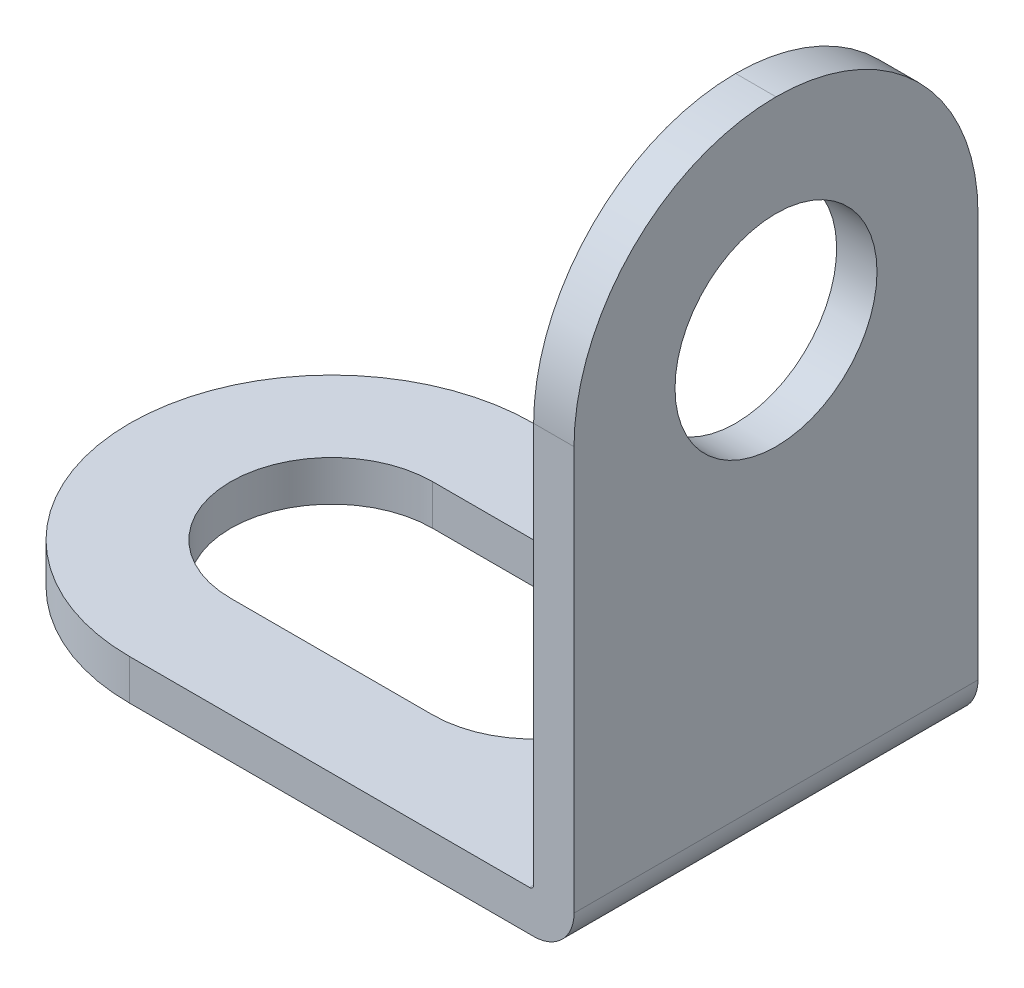
ISO-10303-21;
HEADER;
FILE_DESCRIPTION(('STEP AP214'),'2;1');
FILE_NAME('part.step','',(''),(''),'','','');
FILE_SCHEMA(('AUTOMOTIVE_DESIGN { 1 0 10303 214 1 1 1 1 }'));
ENDSEC;
DATA;
#1=APPLICATION_CONTEXT('core data for automotive mechanical design processes');
#2=APPLICATION_PROTOCOL_DEFINITION('international standard','automotive_design',2000,#1);
#3=PRODUCT_CONTEXT('',#1,'mechanical');
#4=PRODUCT('Part','Part','',(#3));
#5=PRODUCT_RELATED_PRODUCT_CATEGORY('part','',(#4));
#6=PRODUCT_DEFINITION_FORMATION('','',#4);
#7=PRODUCT_DEFINITION_CONTEXT('part definition',#1,'design');
#8=PRODUCT_DEFINITION('design','',#6,#7);
#9=PRODUCT_DEFINITION_SHAPE('','',#8);
#10=(LENGTH_UNIT() NAMED_UNIT(*) SI_UNIT(.MILLI.,.METRE.));
#11=(NAMED_UNIT(*) PLANE_ANGLE_UNIT() SI_UNIT($,.RADIAN.));
#12=(NAMED_UNIT(*) SI_UNIT($,.STERADIAN.) SOLID_ANGLE_UNIT());
#13=UNCERTAINTY_MEASURE_WITH_UNIT(LENGTH_MEASURE(1.E-05),#10,'distance_accuracy_value','');
#14=(GEOMETRIC_REPRESENTATION_CONTEXT(3) GLOBAL_UNCERTAINTY_ASSIGNED_CONTEXT((#13)) GLOBAL_UNIT_ASSIGNED_CONTEXT((#10,
#11,#12)) REPRESENTATION_CONTEXT('',''));
#15=CARTESIAN_POINT('',(0.,0.,0.));
#16=DIRECTION('',(0.,0.,1.));
#17=DIRECTION('',(1.,0.,0.));
#18=AXIS2_PLACEMENT_3D('',#15,#16,#17);
#19=CARTESIAN_POINT('',(0.,0.,5.));
#20=DIRECTION('',(0.,-1.,0.));
#21=DIRECTION('',(1.,0.,0.));
#22=AXIS2_PLACEMENT_3D('',#19,#20,#21);
#23=PLANE('',#22);
#24=DIRECTION('',(1.,0.,0.));
#25=VECTOR('',#24,1.);
#26=CARTESIAN_POINT('',(-10.,0.,2.5));
#27=LINE('',#26,#25);
#28=CARTESIAN_POINT('',(-10.,0.,2.5));
#29=VERTEX_POINT('',#28);
#30=CARTESIAN_POINT('',(-5.,0.,2.5));
#31=VERTEX_POINT('',#30);
#32=EDGE_CURVE('E147',#29,#31,#27,.T.);
#33=ORIENTED_EDGE('',*,*,#32,.F.);
#34=CARTESIAN_POINT('',(-10.,0.,0.));
#35=DIRECTION('',(0.,1.,0.));
#36=DIRECTION('',(-1.,0.,0.));
#37=AXIS2_PLACEMENT_3D('',#34,#35,#36);
#38=CIRCLE('',#37,2.5);
#39=CARTESIAN_POINT('',(-10.,0.,-2.5));
#40=VERTEX_POINT('',#39);
#41=EDGE_CURVE('E50',#40,#29,#38,.T.);
#42=ORIENTED_EDGE('',*,*,#41,.F.);
#43=DIRECTION('',(-1.,0.,0.));
#44=VECTOR('',#43,1.);
#45=CARTESIAN_POINT('',(-10.,0.,-2.5));
#46=LINE('',#45,#44);
#47=CARTESIAN_POINT('',(-5.,0.,-2.5));
#48=VERTEX_POINT('',#47);
#49=EDGE_CURVE('E153',#48,#40,#46,.T.);
#50=ORIENTED_EDGE('',*,*,#49,.F.);
#51=CARTESIAN_POINT('',(-5.,0.,0.));
#52=DIRECTION('',(0.,1.,0.));
#53=DIRECTION('',(-1.,0.,0.));
#54=AXIS2_PLACEMENT_3D('',#51,#52,#53);
#55=CIRCLE('',#54,2.5);
#56=EDGE_CURVE('E138',#31,#48,#55,.T.);
#57=ORIENTED_EDGE('',*,*,#56,.F.);
#58=EDGE_LOOP('',(#33,#42,#50,#57));
#59=FACE_BOUND('',#58,.T.);
#60=DIRECTION('',(-1.,0.,0.));
#61=VECTOR('',#60,1.);
#62=CARTESIAN_POINT('',(0.,0.,5.));
#63=LINE('',#62,#61);
#64=CARTESIAN_POINT('',(-0.1,0.,5.));
#65=VERTEX_POINT('',#64);
#66=CARTESIAN_POINT('',(-10.,0.,5.));
#67=VERTEX_POINT('',#66);
#68=EDGE_CURVE('E169',#65,#67,#63,.T.);
#69=ORIENTED_EDGE('',*,*,#68,.F.);
#70=DIRECTION('',(0.,0.,-1.));
#71=VECTOR('',#70,1.);
#72=CARTESIAN_POINT('',(-0.1,0.,-5.));
#73=LINE('',#72,#71);
#74=CARTESIAN_POINT('',(-0.1,0.,-5.));
#75=VERTEX_POINT('',#74);
#76=EDGE_CURVE('E232',#65,#75,#73,.T.);
#77=ORIENTED_EDGE('',*,*,#76,.T.);
#78=DIRECTION('',(-1.,0.,0.));
#79=VECTOR('',#78,1.);
#80=CARTESIAN_POINT('',(0.,0.,-5.));
#81=LINE('',#80,#79);
#82=CARTESIAN_POINT('',(-10.,0.,-5.));
#83=VERTEX_POINT('',#82);
#84=EDGE_CURVE('E181',#75,#83,#81,.T.);
#85=ORIENTED_EDGE('',*,*,#84,.T.);
#86=CARTESIAN_POINT('',(-10.,0.,0.));
#87=DIRECTION('',(0.,-1.,0.));
#88=DIRECTION('',(1.,0.,0.));
#89=AXIS2_PLACEMENT_3D('',#86,#87,#88);
#90=CIRCLE('',#89,5.);
#91=CARTESIAN_POINT('',(-15.,0.,0.));
#92=VERTEX_POINT('',#91);
#93=EDGE_CURVE('E199',#83,#92,#90,.F.);
#94=ORIENTED_EDGE('',*,*,#93,.T.);
#95=CARTESIAN_POINT('',(-10.,0.,0.));
#96=DIRECTION('',(0.,-1.,0.));
#97=DIRECTION('',(1.,0.,0.));
#98=AXIS2_PLACEMENT_3D('',#95,#96,#97);
#99=CIRCLE('',#98,5.);
#100=EDGE_CURVE('E196',#92,#67,#99,.F.);
#101=ORIENTED_EDGE('',*,*,#100,.T.);
#102=EDGE_LOOP('',(#69,#77,#85,#94,#101));
#103=FACE_BOUND('',#102,.T.);
#104=ADVANCED_FACE('F35',(#59,#103),#23,.F.);
#105=CARTESIAN_POINT('',(0.,-1.,5.));
#106=DIRECTION('',(0.,-1.,0.));
#107=DIRECTION('',(1.,0.,0.));
#108=AXIS2_PLACEMENT_3D('',#105,#106,#107);
#109=PLANE('',#108);
#110=CARTESIAN_POINT('',(-10.,-1.,0.));
#111=DIRECTION('',(0.,-1.,0.));
#112=DIRECTION('',(1.,0.,0.));
#113=AXIS2_PLACEMENT_3D('',#110,#111,#112);
#114=CIRCLE('',#113,2.5);
#115=CARTESIAN_POINT('',(-10.,-1.,2.5));
#116=VERTEX_POINT('',#115);
#117=CARTESIAN_POINT('',(-10.,-1.,-2.5));
#118=VERTEX_POINT('',#117);
#119=EDGE_CURVE('E11',#116,#118,#114,.T.);
#120=ORIENTED_EDGE('',*,*,#119,.F.);
#121=DIRECTION('',(-1.,0.,0.));
#122=VECTOR('',#121,1.);
#123=CARTESIAN_POINT('',(0.,-1.,2.5));
#124=LINE('',#123,#122);
#125=CARTESIAN_POINT('',(-5.,-1.,2.5));
#126=VERTEX_POINT('',#125);
#127=EDGE_CURVE('E241',#126,#116,#124,.T.);
#128=ORIENTED_EDGE('',*,*,#127,.F.);
#129=CARTESIAN_POINT('',(-5.,-0.999999999999999,0.));
#130=DIRECTION('',(0.,-1.,0.));
#131=DIRECTION('',(1.,0.,0.));
#132=AXIS2_PLACEMENT_3D('',#129,#130,#131);
#133=CIRCLE('',#132,2.5);
#134=CARTESIAN_POINT('',(-5.,-0.999999999999999,-2.5));
#135=VERTEX_POINT('',#134);
#136=EDGE_CURVE('E141',#135,#126,#133,.T.);
#137=ORIENTED_EDGE('',*,*,#136,.F.);
#138=DIRECTION('',(1.,0.,0.));
#139=VECTOR('',#138,1.);
#140=CARTESIAN_POINT('',(0.,-1.,-2.5));
#141=LINE('',#140,#139);
#142=EDGE_CURVE('E43',#118,#135,#141,.T.);
#143=ORIENTED_EDGE('',*,*,#142,.F.);
#144=EDGE_LOOP('',(#120,#128,#137,#143));
#145=FACE_BOUND('',#144,.T.);
#146=DIRECTION('',(-1.,0.,0.));
#147=VECTOR('',#146,1.);
#148=CARTESIAN_POINT('',(0.,-1.,-5.));
#149=LINE('',#148,#147);
#150=CARTESIAN_POINT('',(0.,-1.,-5.));
#151=VERTEX_POINT('',#150);
#152=CARTESIAN_POINT('',(-10.,-1.,-5.));
#153=VERTEX_POINT('',#152);
#154=EDGE_CURVE('E183',#151,#153,#149,.T.);
#155=ORIENTED_EDGE('',*,*,#154,.F.);
#156=DIRECTION('',(0.,0.,-1.));
#157=VECTOR('',#156,1.);
#158=CARTESIAN_POINT('',(0.,-1.,5.));
#159=LINE('',#158,#157);
#160=CARTESIAN_POINT('',(0.,-1.,5.));
#161=VERTEX_POINT('',#160);
#162=EDGE_CURVE('E228',#151,#161,#159,.F.);
#163=ORIENTED_EDGE('',*,*,#162,.T.);
#164=DIRECTION('',(-1.,0.,0.));
#165=VECTOR('',#164,1.);
#166=CARTESIAN_POINT('',(0.,-1.,5.));
#167=LINE('',#166,#165);
#168=CARTESIAN_POINT('',(-10.,-1.,5.));
#169=VERTEX_POINT('',#168);
#170=EDGE_CURVE('E171',#161,#169,#167,.T.);
#171=ORIENTED_EDGE('',*,*,#170,.T.);
#172=CARTESIAN_POINT('',(-10.,-1.,0.));
#173=DIRECTION('',(0.,-1.,0.));
#174=DIRECTION('',(1.,0.,0.));
#175=AXIS2_PLACEMENT_3D('',#172,#173,#174);
#176=CIRCLE('',#175,5.);
#177=CARTESIAN_POINT('',(-15.,-1.,0.));
#178=VERTEX_POINT('',#177);
#179=EDGE_CURVE('E201',#169,#178,#176,.T.);
#180=ORIENTED_EDGE('',*,*,#179,.T.);
#181=CARTESIAN_POINT('',(-10.,-1.,0.));
#182=DIRECTION('',(0.,-1.,0.));
#183=DIRECTION('',(1.,0.,0.));
#184=AXIS2_PLACEMENT_3D('',#181,#182,#183);
#185=CIRCLE('',#184,5.);
#186=EDGE_CURVE('E203',#178,#153,#185,.T.);
#187=ORIENTED_EDGE('',*,*,#186,.T.);
#188=EDGE_LOOP('',(#155,#163,#171,#180,#187));
#189=FACE_BOUND('',#188,.T.);
#190=ADVANCED_FACE('F249',(#145,#189),#109,.T.);
#191=CARTESIAN_POINT('',(1.,15.,5.));
#192=DIRECTION('',(1.,0.,0.));
#193=DIRECTION('',(0.,1.,0.));
#194=AXIS2_PLACEMENT_3D('',#191,#192,#193);
#195=PLANE('',#194);
#196=CARTESIAN_POINT('',(1.,10.,0.));
#197=DIRECTION('',(1.,0.,0.));
#198=DIRECTION('',(0.,1.,0.));
#199=AXIS2_PLACEMENT_3D('',#196,#197,#198);
#200=CIRCLE('',#199,2.5);
#201=CARTESIAN_POINT('',(1.,12.5,0.));
#202=VERTEX_POINT('',#201);
#203=EDGE_CURVE('E165',#202,#202,#200,.T.);
#204=ORIENTED_EDGE('',*,*,#203,.F.);
#205=EDGE_LOOP('',(#204));
#206=FACE_BOUND('',#205,.T.);
#207=DIRECTION('',(0.,-1.,0.));
#208=VECTOR('',#207,1.);
#209=CARTESIAN_POINT('',(1.,15.,5.));
#210=LINE('',#209,#208);
#211=CARTESIAN_POINT('',(1.,10.,5.));
#212=VERTEX_POINT('',#211);
#213=CARTESIAN_POINT('',(1.,0.,5.));
#214=VERTEX_POINT('',#213);
#215=EDGE_CURVE('E174',#212,#214,#210,.T.);
#216=ORIENTED_EDGE('',*,*,#215,.T.);
#217=DIRECTION('',(0.,0.,-1.));
#218=VECTOR('',#217,1.);
#219=CARTESIAN_POINT('',(1.,0.,5.));
#220=LINE('',#219,#218);
#221=CARTESIAN_POINT('',(1.,0.,-5.));
#222=VERTEX_POINT('',#221);
#223=EDGE_CURVE('E219',#214,#222,#220,.T.);
#224=ORIENTED_EDGE('',*,*,#223,.T.);
#225=DIRECTION('',(0.,-1.,0.));
#226=VECTOR('',#225,1.);
#227=CARTESIAN_POINT('',(1.,15.,-5.));
#228=LINE('',#227,#226);
#229=CARTESIAN_POINT('',(1.,10.,-5.));
#230=VERTEX_POINT('',#229);
#231=EDGE_CURVE('E186',#230,#222,#228,.T.);
#232=ORIENTED_EDGE('',*,*,#231,.F.);
#233=CARTESIAN_POINT('',(1.,10.,0.));
#234=DIRECTION('',(1.,0.,0.));
#235=DIRECTION('',(0.,1.,0.));
#236=AXIS2_PLACEMENT_3D('',#233,#234,#235);
#237=CIRCLE('',#236,5.);
#238=CARTESIAN_POINT('',(1.,15.,0.));
#239=VERTEX_POINT('',#238);
#240=EDGE_CURVE('E213',#230,#239,#237,.T.);
#241=ORIENTED_EDGE('',*,*,#240,.T.);
#242=CARTESIAN_POINT('',(1.,10.,0.));
#243=DIRECTION('',(1.,0.,0.));
#244=DIRECTION('',(0.,1.,0.));
#245=AXIS2_PLACEMENT_3D('',#242,#243,#244);
#246=CIRCLE('',#245,5.);
#247=EDGE_CURVE('E211',#239,#212,#246,.T.);
#248=ORIENTED_EDGE('',*,*,#247,.T.);
#249=EDGE_LOOP('',(#216,#224,#232,#241,#248));
#250=FACE_BOUND('',#249,.T.);
#251=ADVANCED_FACE('F268',(#206,#250),#195,.T.);
#252=CARTESIAN_POINT('',(0.,15.,5.));
#253=DIRECTION('',(1.,0.,0.));
#254=DIRECTION('',(0.,1.,0.));
#255=AXIS2_PLACEMENT_3D('',#252,#253,#254);
#256=PLANE('',#255);
#257=CARTESIAN_POINT('',(0.,10.,0.));
#258=DIRECTION('',(-1.,0.,0.));
#259=DIRECTION('',(0.,-1.,0.));
#260=AXIS2_PLACEMENT_3D('',#257,#258,#259);
#261=CIRCLE('',#260,2.5);
#262=CARTESIAN_POINT('',(0.,7.5,0.));
#263=VERTEX_POINT('',#262);
#264=EDGE_CURVE('E160',#263,#263,#261,.T.);
#265=ORIENTED_EDGE('',*,*,#264,.F.);
#266=EDGE_LOOP('',(#265));
#267=FACE_BOUND('',#266,.T.);
#268=DIRECTION('',(0.,-1.,0.));
#269=VECTOR('',#268,1.);
#270=CARTESIAN_POINT('',(0.,15.,-5.));
#271=LINE('',#270,#269);
#272=CARTESIAN_POINT('',(0.,10.,-5.));
#273=VERTEX_POINT('',#272);
#274=CARTESIAN_POINT('',(0.,0.0999999999999994,-5.));
#275=VERTEX_POINT('',#274);
#276=EDGE_CURVE('E172',#273,#275,#271,.T.);
#277=ORIENTED_EDGE('',*,*,#276,.T.);
#278=DIRECTION('',(0.,0.,-1.));
#279=VECTOR('',#278,1.);
#280=CARTESIAN_POINT('',(0.,0.1,5.));
#281=LINE('',#280,#279);
#282=CARTESIAN_POINT('',(0.,0.0999999999999994,5.));
#283=VERTEX_POINT('',#282);
#284=EDGE_CURVE('E235',#275,#283,#281,.F.);
#285=ORIENTED_EDGE('',*,*,#284,.T.);
#286=DIRECTION('',(0.,-1.,0.));
#287=VECTOR('',#286,1.);
#288=CARTESIAN_POINT('',(0.,15.,5.));
#289=LINE('',#288,#287);
#290=CARTESIAN_POINT('',(0.,10.,5.));
#291=VERTEX_POINT('',#290);
#292=EDGE_CURVE('E177',#291,#283,#289,.T.);
#293=ORIENTED_EDGE('',*,*,#292,.F.);
#294=CARTESIAN_POINT('',(0.,10.,0.));
#295=DIRECTION('',(1.,0.,0.));
#296=DIRECTION('',(0.,1.,0.));
#297=AXIS2_PLACEMENT_3D('',#294,#295,#296);
#298=CIRCLE('',#297,5.);
#299=CARTESIAN_POINT('',(0.,15.,0.));
#300=VERTEX_POINT('',#299);
#301=EDGE_CURVE('E215',#291,#300,#298,.F.);
#302=ORIENTED_EDGE('',*,*,#301,.T.);
#303=CARTESIAN_POINT('',(0.,10.,0.));
#304=DIRECTION('',(1.,0.,0.));
#305=DIRECTION('',(0.,1.,0.));
#306=AXIS2_PLACEMENT_3D('',#303,#304,#305);
#307=CIRCLE('',#306,5.);
#308=EDGE_CURVE('E217',#300,#273,#307,.F.);
#309=ORIENTED_EDGE('',*,*,#308,.T.);
#310=EDGE_LOOP('',(#277,#285,#293,#302,#309));
#311=FACE_BOUND('',#310,.T.);
#312=ADVANCED_FACE('F312',(#267,#311),#256,.F.);
#313=CARTESIAN_POINT('',(-15.,0.,5.));
#314=DIRECTION('',(0.,0.,-1.));
#315=DIRECTION('',(-1.,0.,0.));
#316=AXIS2_PLACEMENT_3D('',#313,#314,#315);
#317=PLANE('',#316);
#318=ORIENTED_EDGE('',*,*,#170,.F.);
#319=CARTESIAN_POINT('',(0.,0.,5.));
#320=DIRECTION('',(0.,0.,-1.));
#321=DIRECTION('',(-1.,0.,0.));
#322=AXIS2_PLACEMENT_3D('',#319,#320,#321);
#323=CIRCLE('',#322,1.);
#324=EDGE_CURVE('E230',#161,#214,#323,.F.);
#325=ORIENTED_EDGE('',*,*,#324,.T.);
#326=ORIENTED_EDGE('',*,*,#215,.F.);
#327=DIRECTION('',(1.,0.,0.));
#328=VECTOR('',#327,1.);
#329=CARTESIAN_POINT('',(0.,10.,5.));
#330=LINE('',#329,#328);
#331=EDGE_CURVE('E206',#212,#291,#330,.F.);
#332=ORIENTED_EDGE('',*,*,#331,.T.);
#333=ORIENTED_EDGE('',*,*,#292,.T.);
#334=CARTESIAN_POINT('',(-0.1,0.1,5.));
#335=DIRECTION('',(0.,0.,-1.));
#336=DIRECTION('',(-1.,0.,0.));
#337=AXIS2_PLACEMENT_3D('',#334,#335,#336);
#338=CIRCLE('',#337,0.1);
#339=EDGE_CURVE('E239',#283,#65,#338,.T.);
#340=ORIENTED_EDGE('',*,*,#339,.T.);
#341=ORIENTED_EDGE('',*,*,#68,.T.);
#342=DIRECTION('',(0.,1.,0.));
#343=VECTOR('',#342,1.);
#344=CARTESIAN_POINT('',(-10.,-1.,5.));
#345=LINE('',#344,#343);
#346=EDGE_CURVE('E208',#67,#169,#345,.F.);
#347=ORIENTED_EDGE('',*,*,#346,.T.);
#348=EDGE_LOOP('',(#318,#325,#326,#332,#333,#340,#341,#347));
#349=FACE_BOUND('',#348,.T.);
#350=ADVANCED_FACE('F301',(#349),#317,.F.);
#351=CARTESIAN_POINT('',(-15.,0.,-5.));
#352=DIRECTION('',(0.,0.,-1.));
#353=DIRECTION('',(-1.,0.,0.));
#354=AXIS2_PLACEMENT_3D('',#351,#352,#353);
#355=PLANE('',#354);
#356=ORIENTED_EDGE('',*,*,#231,.T.);
#357=CARTESIAN_POINT('',(0.,0.,-5.));
#358=DIRECTION('',(0.,0.,-1.));
#359=DIRECTION('',(-1.,0.,0.));
#360=AXIS2_PLACEMENT_3D('',#357,#358,#359);
#361=CIRCLE('',#360,1.);
#362=EDGE_CURVE('E226',#222,#151,#361,.T.);
#363=ORIENTED_EDGE('',*,*,#362,.T.);
#364=ORIENTED_EDGE('',*,*,#154,.T.);
#365=DIRECTION('',(0.,1.,0.));
#366=VECTOR('',#365,1.);
#367=CARTESIAN_POINT('',(-10.,0.,-5.));
#368=LINE('',#367,#366);
#369=EDGE_CURVE('E193',#153,#83,#368,.T.);
#370=ORIENTED_EDGE('',*,*,#369,.T.);
#371=ORIENTED_EDGE('',*,*,#84,.F.);
#372=CARTESIAN_POINT('',(-0.1,0.1,-5.));
#373=DIRECTION('',(0.,0.,-1.));
#374=DIRECTION('',(-1.,0.,0.));
#375=AXIS2_PLACEMENT_3D('',#372,#373,#374);
#376=CIRCLE('',#375,0.1);
#377=EDGE_CURVE('E237',#75,#275,#376,.F.);
#378=ORIENTED_EDGE('',*,*,#377,.T.);
#379=ORIENTED_EDGE('',*,*,#276,.F.);
#380=DIRECTION('',(1.,0.,0.));
#381=VECTOR('',#380,1.);
#382=CARTESIAN_POINT('',(-15.,10.,-5.));
#383=LINE('',#382,#381);
#384=EDGE_CURVE('E180',#273,#230,#383,.T.);
#385=ORIENTED_EDGE('',*,*,#384,.T.);
#386=EDGE_LOOP('',(#356,#363,#364,#370,#371,#378,#379,#385));
#387=FACE_BOUND('',#386,.T.);
#388=ADVANCED_FACE('F280',(#387),#355,.T.);
#389=CARTESIAN_POINT('',(-10.,-1.,0.));
#390=DIRECTION('',(0.,-1.,0.));
#391=DIRECTION('',(0.,0.,-1.));
#392=AXIS2_PLACEMENT_3D('',#389,#390,#391);
#393=CYLINDRICAL_SURFACE('',#392,5.);
#394=DIRECTION('',(0.,1.,0.));
#395=VECTOR('',#394,1.);
#396=CARTESIAN_POINT('',(-15.,0.,0.));
#397=LINE('',#396,#395);
#398=EDGE_CURVE('E184',#178,#92,#397,.T.);
#399=ORIENTED_EDGE('',*,*,#398,.F.);
#400=ORIENTED_EDGE('',*,*,#179,.F.);
#401=ORIENTED_EDGE('',*,*,#346,.F.);
#402=ORIENTED_EDGE('',*,*,#100,.F.);
#403=EDGE_LOOP('',(#399,#400,#401,#402));
#404=FACE_BOUND('',#403,.T.);
#405=ADVANCED_FACE('F276',(#404),#393,.T.);
#406=CARTESIAN_POINT('',(-10.,0.,0.));
#407=DIRECTION('',(0.,1.,0.));
#408=DIRECTION('',(0.,0.,1.));
#409=AXIS2_PLACEMENT_3D('',#406,#407,#408);
#410=CYLINDRICAL_SURFACE('',#409,5.);
#411=ORIENTED_EDGE('',*,*,#186,.F.);
#412=ORIENTED_EDGE('',*,*,#398,.T.);
#413=ORIENTED_EDGE('',*,*,#93,.F.);
#414=ORIENTED_EDGE('',*,*,#369,.F.);
#415=EDGE_LOOP('',(#411,#412,#413,#414));
#416=FACE_BOUND('',#415,.T.);
#417=ADVANCED_FACE('F272',(#416),#410,.T.);
#418=CARTESIAN_POINT('',(0.,10.,0.));
#419=DIRECTION('',(-1.,0.,0.));
#420=DIRECTION('',(0.,0.,1.));
#421=AXIS2_PLACEMENT_3D('',#418,#419,#420);
#422=CYLINDRICAL_SURFACE('',#421,5.);
#423=DIRECTION('',(1.,0.,0.));
#424=VECTOR('',#423,1.);
#425=CARTESIAN_POINT('',(1.,15.,0.));
#426=LINE('',#425,#424);
#427=EDGE_CURVE('E168',#300,#239,#426,.T.);
#428=ORIENTED_EDGE('',*,*,#427,.F.);
#429=ORIENTED_EDGE('',*,*,#301,.F.);
#430=ORIENTED_EDGE('',*,*,#331,.F.);
#431=ORIENTED_EDGE('',*,*,#247,.F.);
#432=EDGE_LOOP('',(#428,#429,#430,#431));
#433=FACE_BOUND('',#432,.T.);
#434=ADVANCED_FACE('F275',(#433),#422,.T.);
#435=CARTESIAN_POINT('',(-15.,10.,0.));
#436=DIRECTION('',(1.,0.,0.));
#437=DIRECTION('',(0.,0.,-1.));
#438=AXIS2_PLACEMENT_3D('',#435,#436,#437);
#439=CYLINDRICAL_SURFACE('',#438,5.);
#440=ORIENTED_EDGE('',*,*,#308,.F.);
#441=ORIENTED_EDGE('',*,*,#427,.T.);
#442=ORIENTED_EDGE('',*,*,#240,.F.);
#443=ORIENTED_EDGE('',*,*,#384,.F.);
#444=EDGE_LOOP('',(#440,#441,#442,#443));
#445=FACE_BOUND('',#444,.T.);
#446=ADVANCED_FACE('F282',(#445),#439,.T.);
#447=CARTESIAN_POINT('',(0.,0.,5.));
#448=DIRECTION('',(0.,0.,-1.));
#449=DIRECTION('',(-1.,0.,0.));
#450=AXIS2_PLACEMENT_3D('',#447,#448,#449);
#451=CYLINDRICAL_SURFACE('',#450,1.);
#452=ORIENTED_EDGE('',*,*,#324,.F.);
#453=ORIENTED_EDGE('',*,*,#162,.F.);
#454=ORIENTED_EDGE('',*,*,#362,.F.);
#455=ORIENTED_EDGE('',*,*,#223,.F.);
#456=EDGE_LOOP('',(#452,#453,#454,#455));
#457=FACE_BOUND('',#456,.T.);
#458=ADVANCED_FACE('F285',(#457),#451,.T.);
#459=CARTESIAN_POINT('',(-0.1,0.1,5.));
#460=DIRECTION('',(0.,0.,1.));
#461=DIRECTION('',(1.,0.,0.));
#462=AXIS2_PLACEMENT_3D('',#459,#460,#461);
#463=CYLINDRICAL_SURFACE('',#462,0.1);
#464=ORIENTED_EDGE('',*,*,#339,.F.);
#465=ORIENTED_EDGE('',*,*,#284,.F.);
#466=ORIENTED_EDGE('',*,*,#377,.F.);
#467=ORIENTED_EDGE('',*,*,#76,.F.);
#468=EDGE_LOOP('',(#464,#465,#466,#467));
#469=FACE_BOUND('',#468,.T.);
#470=ADVANCED_FACE('F37',(#469),#463,.F.);
#471=CARTESIAN_POINT('',(10.,10.,0.));
#472=DIRECTION('',(-1.,0.,0.));
#473=DIRECTION('',(0.,-1.,0.));
#474=AXIS2_PLACEMENT_3D('',#471,#472,#473);
#475=CYLINDRICAL_SURFACE('',#474,2.5);
#476=ORIENTED_EDGE('',*,*,#203,.T.);
#477=EDGE_LOOP('',(#476));
#478=FACE_BOUND('',#477,.T.);
#479=ORIENTED_EDGE('',*,*,#264,.T.);
#480=EDGE_LOOP('',(#479));
#481=FACE_BOUND('',#480,.T.);
#482=ADVANCED_FACE('F253',(#478,#481),#475,.F.);
#483=CARTESIAN_POINT('',(-10.,-10.,0.));
#484=DIRECTION('',(0.,1.,0.));
#485=DIRECTION('',(-1.,0.,0.));
#486=AXIS2_PLACEMENT_3D('',#483,#484,#485);
#487=CYLINDRICAL_SURFACE('',#486,2.5);
#488=ORIENTED_EDGE('',*,*,#119,.T.);
#489=DIRECTION('',(0.,1.,0.));
#490=VECTOR('',#489,1.);
#491=CARTESIAN_POINT('',(-10.,-10.,-2.5));
#492=LINE('',#491,#490);
#493=EDGE_CURVE('E158',#118,#40,#492,.T.);
#494=ORIENTED_EDGE('',*,*,#493,.T.);
#495=ORIENTED_EDGE('',*,*,#41,.T.);
#496=DIRECTION('',(0.,1.,0.));
#497=VECTOR('',#496,1.);
#498=CARTESIAN_POINT('',(-10.,-10.,2.5));
#499=LINE('',#498,#497);
#500=EDGE_CURVE('E144',#116,#29,#499,.T.);
#501=ORIENTED_EDGE('',*,*,#500,.F.);
#502=EDGE_LOOP('',(#488,#494,#495,#501));
#503=FACE_BOUND('',#502,.T.);
#504=ADVANCED_FACE('F251',(#503),#487,.F.);
#505=CARTESIAN_POINT('',(-10.,-10.,-2.5));
#506=DIRECTION('',(0.,0.,-1.));
#507=DIRECTION('',(-1.,0.,0.));
#508=AXIS2_PLACEMENT_3D('',#505,#506,#507);
#509=PLANE('',#508);
#510=ORIENTED_EDGE('',*,*,#142,.T.);
#511=DIRECTION('',(0.,1.,0.));
#512=VECTOR('',#511,1.);
#513=CARTESIAN_POINT('',(-5.,-10.,-2.5));
#514=LINE('',#513,#512);
#515=EDGE_CURVE('E143',#135,#48,#514,.T.);
#516=ORIENTED_EDGE('',*,*,#515,.T.);
#517=ORIENTED_EDGE('',*,*,#49,.T.);
#518=ORIENTED_EDGE('',*,*,#493,.F.);
#519=EDGE_LOOP('',(#510,#516,#517,#518));
#520=FACE_BOUND('',#519,.T.);
#521=ADVANCED_FACE('F246',(#520),#509,.F.);
#522=CARTESIAN_POINT('',(-5.,-10.,0.));
#523=DIRECTION('',(0.,1.,0.));
#524=DIRECTION('',(-1.,0.,0.));
#525=AXIS2_PLACEMENT_3D('',#522,#523,#524);
#526=CYLINDRICAL_SURFACE('',#525,2.5);
#527=ORIENTED_EDGE('',*,*,#136,.T.);
#528=DIRECTION('',(0.,1.,0.));
#529=VECTOR('',#528,1.);
#530=CARTESIAN_POINT('',(-5.,-10.,2.5));
#531=LINE('',#530,#529);
#532=EDGE_CURVE('E58',#126,#31,#531,.T.);
#533=ORIENTED_EDGE('',*,*,#532,.T.);
#534=ORIENTED_EDGE('',*,*,#56,.T.);
#535=ORIENTED_EDGE('',*,*,#515,.F.);
#536=EDGE_LOOP('',(#527,#533,#534,#535));
#537=FACE_BOUND('',#536,.T.);
#538=ADVANCED_FACE('F135',(#537),#526,.F.);
#539=CARTESIAN_POINT('',(-10.,-10.,2.5));
#540=DIRECTION('',(0.,0.,1.));
#541=DIRECTION('',(1.,0.,0.));
#542=AXIS2_PLACEMENT_3D('',#539,#540,#541);
#543=PLANE('',#542);
#544=ORIENTED_EDGE('',*,*,#127,.T.);
#545=ORIENTED_EDGE('',*,*,#500,.T.);
#546=ORIENTED_EDGE('',*,*,#32,.T.);
#547=ORIENTED_EDGE('',*,*,#532,.F.);
#548=EDGE_LOOP('',(#544,#545,#546,#547));
#549=FACE_BOUND('',#548,.T.);
#550=ADVANCED_FACE('F148',(#549),#543,.F.);
#551=CLOSED_SHELL('',(#104,#190,#251,#312,#350,#388,#405,#417,#434,#446,#458,#470,#482,#504,
#521,#538,#550));
#552=MANIFOLD_SOLID_BREP('B2',#551);
#553=ADVANCED_BREP_SHAPE_REPRESENTATION('',(#18,#552),#14);
#554=SHAPE_DEFINITION_REPRESENTATION(#9,#553);
ENDSEC;
END-ISO-10303-21;
